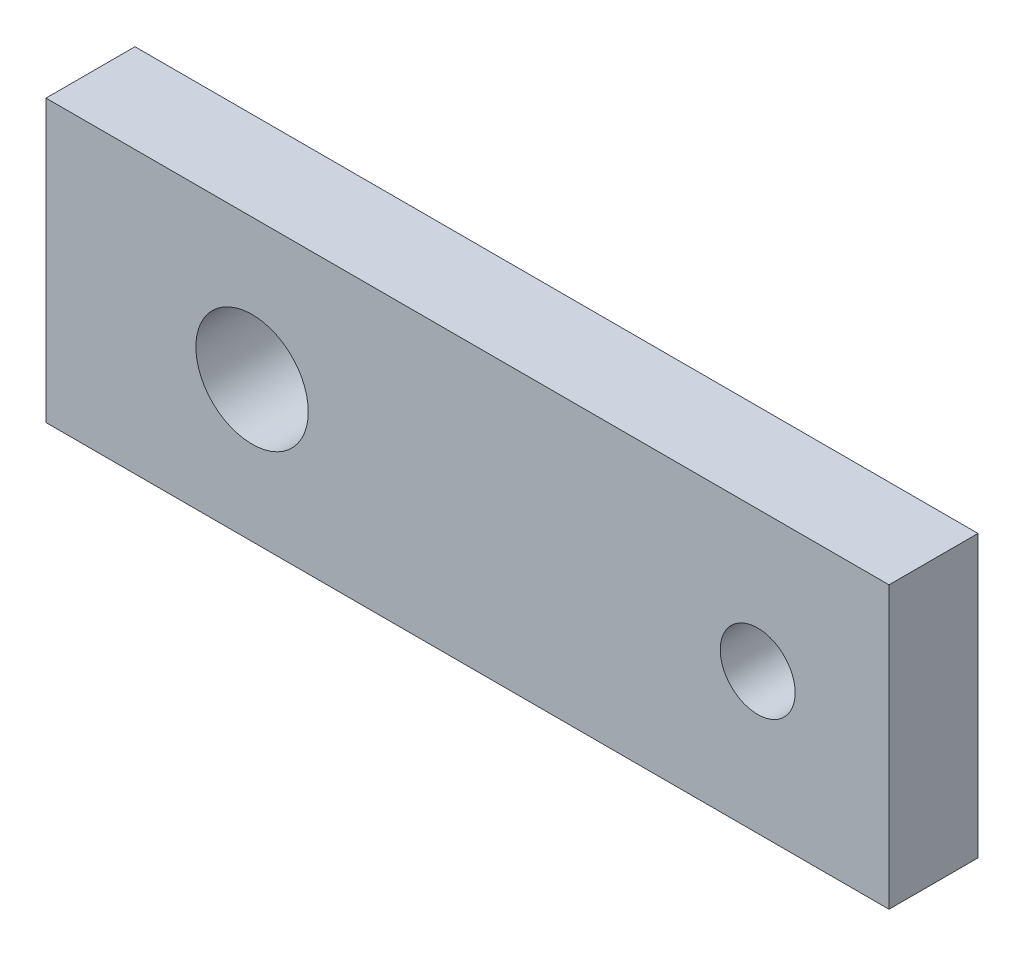
ISO-10303-21;
HEADER;
FILE_DESCRIPTION(('STEP AP214'),'2;1');
FILE_NAME('part.step','',(''),(''),'','','');
FILE_SCHEMA(('AUTOMOTIVE_DESIGN { 1 0 10303 214 1 1 1 1 }'));
ENDSEC;
DATA;
#1=APPLICATION_CONTEXT('core data for automotive mechanical design processes');
#2=APPLICATION_PROTOCOL_DEFINITION('international standard','automotive_design',2000,#1);
#3=PRODUCT_CONTEXT('',#1,'mechanical');
#4=PRODUCT('Part','Part','',(#3));
#5=PRODUCT_RELATED_PRODUCT_CATEGORY('part','',(#4));
#6=PRODUCT_DEFINITION_FORMATION('','',#4);
#7=PRODUCT_DEFINITION_CONTEXT('part definition',#1,'design');
#8=PRODUCT_DEFINITION('design','',#6,#7);
#9=PRODUCT_DEFINITION_SHAPE('','',#8);
#10=(LENGTH_UNIT() NAMED_UNIT(*) SI_UNIT(.MILLI.,.METRE.));
#11=(NAMED_UNIT(*) PLANE_ANGLE_UNIT() SI_UNIT($,.RADIAN.));
#12=(NAMED_UNIT(*) SI_UNIT($,.STERADIAN.) SOLID_ANGLE_UNIT());
#13=UNCERTAINTY_MEASURE_WITH_UNIT(LENGTH_MEASURE(1.E-05),#10,'distance_accuracy_value','');
#14=(GEOMETRIC_REPRESENTATION_CONTEXT(3) GLOBAL_UNCERTAINTY_ASSIGNED_CONTEXT((#13)) GLOBAL_UNIT_ASSIGNED_CONTEXT((#10,
#11,#12)) REPRESENTATION_CONTEXT('',''));
#15=CARTESIAN_POINT('',(0.,0.,0.));
#16=DIRECTION('',(0.,0.,1.));
#17=DIRECTION('',(1.,0.,0.));
#18=AXIS2_PLACEMENT_3D('',#15,#16,#17);
#19=CARTESIAN_POINT('',(0.,0.,9.5));
#20=DIRECTION('',(0.,0.,-1.));
#21=DIRECTION('',(-1.,0.,0.));
#22=AXIS2_PLACEMENT_3D('',#19,#20,#21);
#23=PLANE('',#22);
#24=DIRECTION('',(0.,1.,0.));
#25=VECTOR('',#24,1.);
#26=CARTESIAN_POINT('',(45.,-15.,9.5));
#27=LINE('',#26,#25);
#28=CARTESIAN_POINT('',(45.,-15.,9.5));
#29=VERTEX_POINT('',#28);
#30=CARTESIAN_POINT('',(45.,15.,9.5));
#31=VERTEX_POINT('',#30);
#32=EDGE_CURVE('E86',#29,#31,#27,.T.);
#33=ORIENTED_EDGE('',*,*,#32,.T.);
#34=DIRECTION('',(-1.,0.,0.));
#35=VECTOR('',#34,1.);
#36=CARTESIAN_POINT('',(-45.,15.,9.5));
#37=LINE('',#36,#35);
#38=CARTESIAN_POINT('',(-45.,15.,9.5));
#39=VERTEX_POINT('',#38);
#40=EDGE_CURVE('E81',#31,#39,#37,.T.);
#41=ORIENTED_EDGE('',*,*,#40,.T.);
#42=DIRECTION('',(0.,-1.,0.));
#43=VECTOR('',#42,1.);
#44=CARTESIAN_POINT('',(-45.,-15.,9.5));
#45=LINE('',#44,#43);
#46=CARTESIAN_POINT('',(-45.,-15.,9.5));
#47=VERTEX_POINT('',#46);
#48=EDGE_CURVE('E84',#39,#47,#45,.T.);
#49=ORIENTED_EDGE('',*,*,#48,.T.);
#50=DIRECTION('',(1.,0.,0.));
#51=VECTOR('',#50,1.);
#52=CARTESIAN_POINT('',(-45.,-15.,9.5));
#53=LINE('',#52,#51);
#54=EDGE_CURVE('E51',#47,#29,#53,.T.);
#55=ORIENTED_EDGE('',*,*,#54,.T.);
#56=EDGE_LOOP('',(#33,#41,#49,#55));
#57=FACE_BOUND('',#56,.T.);
#58=CARTESIAN_POINT('',(-23.,0.,9.5));
#59=DIRECTION('',(0.,0.,1.));
#60=DIRECTION('',(1.,0.,0.));
#61=AXIS2_PLACEMENT_3D('',#58,#59,#60);
#62=CIRCLE('',#61,6.);
#63=CARTESIAN_POINT('',(-17.,0.,9.5));
#64=VERTEX_POINT('',#63);
#65=EDGE_CURVE('E101',#64,#64,#62,.T.);
#66=ORIENTED_EDGE('',*,*,#65,.F.);
#67=EDGE_LOOP('',(#66));
#68=FACE_BOUND('',#67,.T.);
#69=CARTESIAN_POINT('',(30.98,0.,9.5));
#70=DIRECTION('',(0.,0.,1.));
#71=DIRECTION('',(1.,0.,0.));
#72=AXIS2_PLACEMENT_3D('',#69,#70,#71);
#73=CIRCLE('',#72,4.00000000000001);
#74=CARTESIAN_POINT('',(34.98,0.,9.5));
#75=VERTEX_POINT('',#74);
#76=EDGE_CURVE('E116',#75,#75,#73,.T.);
#77=ORIENTED_EDGE('',*,*,#76,.F.);
#78=EDGE_LOOP('',(#77));
#79=FACE_BOUND('',#78,.T.);
#80=ADVANCED_FACE('F34',(#57,#68,#79),#23,.F.);
#81=CARTESIAN_POINT('',(0.,0.,0.));
#82=DIRECTION('',(0.,0.,-1.));
#83=DIRECTION('',(-1.,0.,0.));
#84=AXIS2_PLACEMENT_3D('',#81,#82,#83);
#85=PLANE('',#84);
#86=CARTESIAN_POINT('',(-23.,0.,0.));
#87=DIRECTION('',(0.,0.,1.));
#88=DIRECTION('',(1.,0.,0.));
#89=AXIS2_PLACEMENT_3D('',#86,#87,#88);
#90=CIRCLE('',#89,6.);
#91=CARTESIAN_POINT('',(-17.,0.,0.));
#92=VERTEX_POINT('',#91);
#93=EDGE_CURVE('E113',#92,#92,#90,.T.);
#94=ORIENTED_EDGE('',*,*,#93,.T.);
#95=EDGE_LOOP('',(#94));
#96=FACE_BOUND('',#95,.T.);
#97=DIRECTION('',(0.,1.,0.));
#98=VECTOR('',#97,1.);
#99=CARTESIAN_POINT('',(45.,-15.,0.));
#100=LINE('',#99,#98);
#101=CARTESIAN_POINT('',(45.,-15.,0.));
#102=VERTEX_POINT('',#101);
#103=CARTESIAN_POINT('',(45.,15.,0.));
#104=VERTEX_POINT('',#103);
#105=EDGE_CURVE('E98',#102,#104,#100,.T.);
#106=ORIENTED_EDGE('',*,*,#105,.F.);
#107=DIRECTION('',(1.,0.,0.));
#108=VECTOR('',#107,1.);
#109=CARTESIAN_POINT('',(-45.,-15.,0.));
#110=LINE('',#109,#108);
#111=CARTESIAN_POINT('',(-45.,-15.,0.));
#112=VERTEX_POINT('',#111);
#113=EDGE_CURVE('E74',#112,#102,#110,.T.);
#114=ORIENTED_EDGE('',*,*,#113,.F.);
#115=DIRECTION('',(0.,-1.,0.));
#116=VECTOR('',#115,1.);
#117=CARTESIAN_POINT('',(-45.,-15.,0.));
#118=LINE('',#117,#116);
#119=CARTESIAN_POINT('',(-45.,15.,0.));
#120=VERTEX_POINT('',#119);
#121=EDGE_CURVE('E68',#120,#112,#118,.T.);
#122=ORIENTED_EDGE('',*,*,#121,.F.);
#123=DIRECTION('',(-1.,0.,0.));
#124=VECTOR('',#123,1.);
#125=CARTESIAN_POINT('',(-45.,15.,0.));
#126=LINE('',#125,#124);
#127=EDGE_CURVE('E90',#104,#120,#126,.T.);
#128=ORIENTED_EDGE('',*,*,#127,.F.);
#129=EDGE_LOOP('',(#106,#114,#122,#128));
#130=FACE_BOUND('',#129,.T.);
#131=CARTESIAN_POINT('',(30.98,0.,0.));
#132=DIRECTION('',(0.,0.,1.));
#133=DIRECTION('',(1.,0.,0.));
#134=AXIS2_PLACEMENT_3D('',#131,#132,#133);
#135=CIRCLE('',#134,4.00000000000001);
#136=CARTESIAN_POINT('',(34.98,0.,0.));
#137=VERTEX_POINT('',#136);
#138=EDGE_CURVE('E119',#137,#137,#135,.T.);
#139=ORIENTED_EDGE('',*,*,#138,.T.);
#140=EDGE_LOOP('',(#139));
#141=FACE_BOUND('',#140,.T.);
#142=ADVANCED_FACE('F109',(#96,#130,#141),#85,.T.);
#143=CARTESIAN_POINT('',(45.,-15.,9.5));
#144=DIRECTION('',(-1.,0.,0.));
#145=DIRECTION('',(0.,0.,1.));
#146=AXIS2_PLACEMENT_3D('',#143,#144,#145);
#147=PLANE('',#146);
#148=ORIENTED_EDGE('',*,*,#105,.T.);
#149=DIRECTION('',(0.,0.,-1.));
#150=VECTOR('',#149,1.);
#151=CARTESIAN_POINT('',(45.,15.,9.5));
#152=LINE('',#151,#150);
#153=EDGE_CURVE('E11',#31,#104,#152,.T.);
#154=ORIENTED_EDGE('',*,*,#153,.F.);
#155=ORIENTED_EDGE('',*,*,#32,.F.);
#156=DIRECTION('',(0.,0.,-1.));
#157=VECTOR('',#156,1.);
#158=CARTESIAN_POINT('',(45.,-15.,9.5));
#159=LINE('',#158,#157);
#160=EDGE_CURVE('E94',#29,#102,#159,.T.);
#161=ORIENTED_EDGE('',*,*,#160,.T.);
#162=EDGE_LOOP('',(#148,#154,#155,#161));
#163=FACE_BOUND('',#162,.T.);
#164=ADVANCED_FACE('F36',(#163),#147,.F.);
#165=CARTESIAN_POINT('',(-45.,15.,9.5));
#166=DIRECTION('',(0.,-1.,0.));
#167=DIRECTION('',(0.,0.,-1.));
#168=AXIS2_PLACEMENT_3D('',#165,#166,#167);
#169=PLANE('',#168);
#170=ORIENTED_EDGE('',*,*,#127,.T.);
#171=DIRECTION('',(0.,0.,-1.));
#172=VECTOR('',#171,1.);
#173=CARTESIAN_POINT('',(-45.,15.,9.5));
#174=LINE('',#173,#172);
#175=EDGE_CURVE('E43',#39,#120,#174,.T.);
#176=ORIENTED_EDGE('',*,*,#175,.F.);
#177=ORIENTED_EDGE('',*,*,#40,.F.);
#178=ORIENTED_EDGE('',*,*,#153,.T.);
#179=EDGE_LOOP('',(#170,#176,#177,#178));
#180=FACE_BOUND('',#179,.T.);
#181=ADVANCED_FACE('F89',(#180),#169,.F.);
#182=CARTESIAN_POINT('',(-45.,-15.,9.5));
#183=DIRECTION('',(1.,0.,0.));
#184=DIRECTION('',(0.,0.,-1.));
#185=AXIS2_PLACEMENT_3D('',#182,#183,#184);
#186=PLANE('',#185);
#187=ORIENTED_EDGE('',*,*,#121,.T.);
#188=DIRECTION('',(0.,0.,-1.));
#189=VECTOR('',#188,1.);
#190=CARTESIAN_POINT('',(-45.,-15.,9.5));
#191=LINE('',#190,#189);
#192=EDGE_CURVE('E91',#47,#112,#191,.T.);
#193=ORIENTED_EDGE('',*,*,#192,.F.);
#194=ORIENTED_EDGE('',*,*,#48,.F.);
#195=ORIENTED_EDGE('',*,*,#175,.T.);
#196=EDGE_LOOP('',(#187,#193,#194,#195));
#197=FACE_BOUND('',#196,.T.);
#198=ADVANCED_FACE('F92',(#197),#186,.F.);
#199=CARTESIAN_POINT('',(-45.,-15.,9.5));
#200=DIRECTION('',(0.,1.,0.));
#201=DIRECTION('',(0.,0.,1.));
#202=AXIS2_PLACEMENT_3D('',#199,#200,#201);
#203=PLANE('',#202);
#204=CARTESIAN_POINT('',(6.99999999999999,-15.,5.));
#205=DIRECTION('',(0.,-1.,0.));
#206=DIRECTION('',(0.,0.,-1.));
#207=AXIS2_PLACEMENT_3D('',#204,#205,#206);
#208=CIRCLE('',#207,2.5);
#209=CARTESIAN_POINT('',(6.99999999999999,-15.,2.5));
#210=VERTEX_POINT('',#209);
#211=EDGE_CURVE('E131',#210,#210,#208,.T.);
#212=ORIENTED_EDGE('',*,*,#211,.F.);
#213=EDGE_LOOP('',(#212));
#214=FACE_BOUND('',#213,.T.);
#215=CARTESIAN_POINT('',(-37.,-15.,5.));
#216=DIRECTION('',(0.,-1.,0.));
#217=DIRECTION('',(0.,0.,-1.));
#218=AXIS2_PLACEMENT_3D('',#215,#216,#217);
#219=CIRCLE('',#218,2.49999999999999);
#220=CARTESIAN_POINT('',(-37.,-15.,2.50000000000001));
#221=VERTEX_POINT('',#220);
#222=EDGE_CURVE('E125',#221,#221,#219,.T.);
#223=ORIENTED_EDGE('',*,*,#222,.F.);
#224=EDGE_LOOP('',(#223));
#225=FACE_BOUND('',#224,.T.);
#226=ORIENTED_EDGE('',*,*,#113,.T.);
#227=ORIENTED_EDGE('',*,*,#160,.F.);
#228=ORIENTED_EDGE('',*,*,#54,.F.);
#229=ORIENTED_EDGE('',*,*,#192,.T.);
#230=EDGE_LOOP('',(#226,#227,#228,#229));
#231=FACE_BOUND('',#230,.T.);
#232=ADVANCED_FACE('F106',(#214,#225,#231),#203,.F.);
#233=CARTESIAN_POINT('',(-23.,0.,9.5));
#234=DIRECTION('',(0.,0.,-1.));
#235=DIRECTION('',(-1.,0.,0.));
#236=AXIS2_PLACEMENT_3D('',#233,#234,#235);
#237=CYLINDRICAL_SURFACE('',#236,6.);
#238=ORIENTED_EDGE('',*,*,#65,.T.);
#239=EDGE_LOOP('',(#238));
#240=FACE_BOUND('',#239,.T.);
#241=ORIENTED_EDGE('',*,*,#93,.F.);
#242=EDGE_LOOP('',(#241));
#243=FACE_BOUND('',#242,.T.);
#244=ADVANCED_FACE('F148',(#240,#243),#237,.F.);
#245=CARTESIAN_POINT('',(30.98,0.,9.5));
#246=DIRECTION('',(0.,0.,-1.));
#247=DIRECTION('',(-1.,0.,0.));
#248=AXIS2_PLACEMENT_3D('',#245,#246,#247);
#249=CYLINDRICAL_SURFACE('',#248,4.00000000000001);
#250=ORIENTED_EDGE('',*,*,#76,.T.);
#251=EDGE_LOOP('',(#250));
#252=FACE_BOUND('',#251,.T.);
#253=ORIENTED_EDGE('',*,*,#138,.F.);
#254=EDGE_LOOP('',(#253));
#255=FACE_BOUND('',#254,.T.);
#256=ADVANCED_FACE('F154',(#252,#255),#249,.F.);
#257=CARTESIAN_POINT('',(-37.,0.,5.));
#258=DIRECTION('',(0.,-1.,0.));
#259=DIRECTION('',(0.,0.,-1.));
#260=AXIS2_PLACEMENT_3D('',#257,#258,#259);
#261=CYLINDRICAL_SURFACE('',#260,2.49999999999999);
#262=CARTESIAN_POINT('',(-37.,0.,5.));
#263=DIRECTION('',(0.,-1.,0.));
#264=DIRECTION('',(0.,0.,-1.));
#265=AXIS2_PLACEMENT_3D('',#262,#263,#264);
#266=CIRCLE('',#265,2.49999999999999);
#267=CARTESIAN_POINT('',(-37.,0.,2.50000000000001));
#268=VERTEX_POINT('',#267);
#269=EDGE_CURVE('E128',#268,#268,#266,.T.);
#270=ORIENTED_EDGE('',*,*,#269,.F.);
#271=EDGE_LOOP('',(#270));
#272=FACE_BOUND('',#271,.T.);
#273=ORIENTED_EDGE('',*,*,#222,.T.);
#274=EDGE_LOOP('',(#273));
#275=FACE_BOUND('',#274,.T.);
#276=ADVANCED_FACE('F152',(#272,#275),#261,.F.);
#277=CARTESIAN_POINT('',(-37.,0.,5.));
#278=DIRECTION('',(0.,-1.,0.));
#279=DIRECTION('',(0.,0.,-1.));
#280=AXIS2_PLACEMENT_3D('',#277,#278,#279);
#281=PLANE('',#280);
#282=ORIENTED_EDGE('',*,*,#269,.T.);
#283=EDGE_LOOP('',(#282));
#284=FACE_BOUND('',#283,.T.);
#285=ADVANCED_FACE('F142',(#284),#281,.T.);
#286=CARTESIAN_POINT('',(6.99999999999999,0.,5.));
#287=DIRECTION('',(0.,-1.,0.));
#288=DIRECTION('',(0.,0.,-1.));
#289=AXIS2_PLACEMENT_3D('',#286,#287,#288);
#290=CYLINDRICAL_SURFACE('',#289,2.5);
#291=CARTESIAN_POINT('',(6.99999999999999,0.,5.));
#292=DIRECTION('',(0.,-1.,0.));
#293=DIRECTION('',(0.,0.,-1.));
#294=AXIS2_PLACEMENT_3D('',#291,#292,#293);
#295=CIRCLE('',#294,2.5);
#296=CARTESIAN_POINT('',(6.99999999999999,0.,2.5));
#297=VERTEX_POINT('',#296);
#298=EDGE_CURVE('E122',#297,#297,#295,.T.);
#299=ORIENTED_EDGE('',*,*,#298,.F.);
#300=EDGE_LOOP('',(#299));
#301=FACE_BOUND('',#300,.T.);
#302=ORIENTED_EDGE('',*,*,#211,.T.);
#303=EDGE_LOOP('',(#302));
#304=FACE_BOUND('',#303,.T.);
#305=ADVANCED_FACE('F139',(#301,#304),#290,.F.);
#306=CARTESIAN_POINT('',(6.99999999999999,0.,5.));
#307=DIRECTION('',(0.,-1.,0.));
#308=DIRECTION('',(0.,0.,-1.));
#309=AXIS2_PLACEMENT_3D('',#306,#307,#308);
#310=PLANE('',#309);
#311=ORIENTED_EDGE('',*,*,#298,.T.);
#312=EDGE_LOOP('',(#311));
#313=FACE_BOUND('',#312,.T.);
#314=ADVANCED_FACE('F137',(#313),#310,.T.);
#315=CLOSED_SHELL('',(#80,#142,#164,#181,#198,#232,#244,#256,#276,#285,#305,#314));
#316=MANIFOLD_SOLID_BREP('B2',#315);
#317=ADVANCED_BREP_SHAPE_REPRESENTATION('',(#18,#316),#14);
#318=SHAPE_DEFINITION_REPRESENTATION(#9,#317);
ENDSEC;
END-ISO-10303-21;
